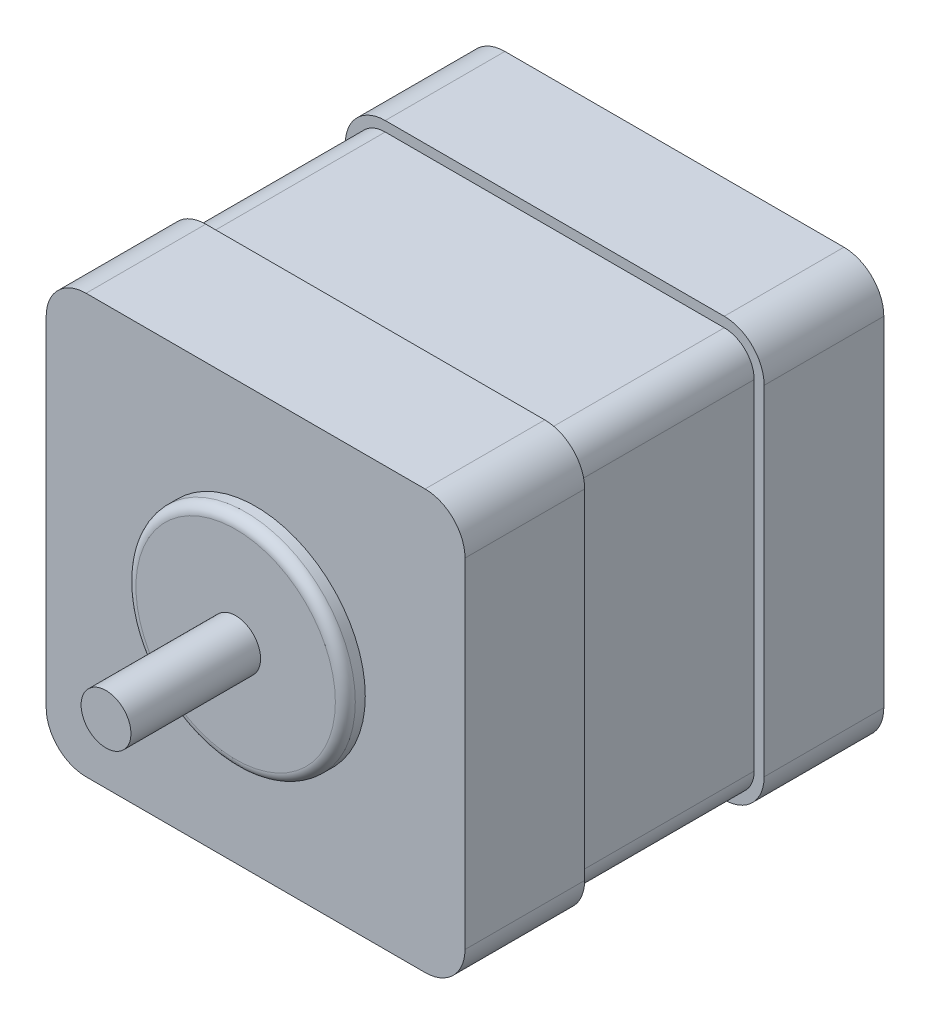
ISO-10303-21;
HEADER;
FILE_DESCRIPTION(('STEP AP214'),'2;1');
FILE_NAME('part.step','',(''),(''),'','','');
FILE_SCHEMA(('AUTOMOTIVE_DESIGN { 1 0 10303 214 1 1 1 1 }'));
ENDSEC;
DATA;
#1=APPLICATION_CONTEXT('core data for automotive mechanical design processes');
#2=APPLICATION_PROTOCOL_DEFINITION('international standard','automotive_design',2000,#1);
#3=PRODUCT_CONTEXT('',#1,'mechanical');
#4=PRODUCT('Part','Part','',(#3));
#5=PRODUCT_RELATED_PRODUCT_CATEGORY('part','',(#4));
#6=PRODUCT_DEFINITION_FORMATION('','',#4);
#7=PRODUCT_DEFINITION_CONTEXT('part definition',#1,'design');
#8=PRODUCT_DEFINITION('design','',#6,#7);
#9=PRODUCT_DEFINITION_SHAPE('','',#8);
#10=(LENGTH_UNIT() NAMED_UNIT(*) SI_UNIT(.MILLI.,.METRE.));
#11=(NAMED_UNIT(*) PLANE_ANGLE_UNIT() SI_UNIT($,.RADIAN.));
#12=(NAMED_UNIT(*) SI_UNIT($,.STERADIAN.) SOLID_ANGLE_UNIT());
#13=UNCERTAINTY_MEASURE_WITH_UNIT(LENGTH_MEASURE(1.E-05),#10,'distance_accuracy_value','');
#14=(GEOMETRIC_REPRESENTATION_CONTEXT(3) GLOBAL_UNCERTAINTY_ASSIGNED_CONTEXT((#13)) GLOBAL_UNIT_ASSIGNED_CONTEXT((#10,
#11,#12)) REPRESENTATION_CONTEXT('',''));
#15=CARTESIAN_POINT('',(0.,0.,0.));
#16=DIRECTION('',(0.,0.,1.));
#17=DIRECTION('',(1.,0.,0.));
#18=AXIS2_PLACEMENT_3D('',#15,#16,#17);
#19=CARTESIAN_POINT('',(-17.,17.,42.));
#20=DIRECTION('',(0.,0.,-1.));
#21=DIRECTION('',(-1.,0.,0.));
#22=AXIS2_PLACEMENT_3D('',#19,#20,#21);
#23=CYLINDRICAL_SURFACE('',#22,3.);
#24=CARTESIAN_POINT('',(-17.,17.,12.));
#25=DIRECTION('',(0.,0.,-1.));
#26=DIRECTION('',(-1.,0.,0.));
#27=AXIS2_PLACEMENT_3D('',#24,#25,#26);
#28=CIRCLE('',#27,3.);
#29=CARTESIAN_POINT('',(-20.,17.,12.));
#30=VERTEX_POINT('',#29);
#31=CARTESIAN_POINT('',(-17.,20.,12.));
#32=VERTEX_POINT('',#31);
#33=EDGE_CURVE('E359',#30,#32,#28,.T.);
#34=ORIENTED_EDGE('',*,*,#33,.F.);
#35=DIRECTION('',(0.,0.,-1.));
#36=VECTOR('',#35,1.);
#37=CARTESIAN_POINT('',(-20.,17.,42.));
#38=LINE('',#37,#36);
#39=CARTESIAN_POINT('',(-20.,17.,30.));
#40=VERTEX_POINT('',#39);
#41=EDGE_CURVE('E489',#40,#30,#38,.T.);
#42=ORIENTED_EDGE('',*,*,#41,.F.);
#43=CARTESIAN_POINT('',(-17.,17.,30.));
#44=DIRECTION('',(0.,0.,1.));
#45=DIRECTION('',(1.,0.,0.));
#46=AXIS2_PLACEMENT_3D('',#43,#44,#45);
#47=CIRCLE('',#46,3.);
#48=CARTESIAN_POINT('',(-17.,20.,30.));
#49=VERTEX_POINT('',#48);
#50=EDGE_CURVE('E451',#49,#40,#47,.T.);
#51=ORIENTED_EDGE('',*,*,#50,.F.);
#52=DIRECTION('',(0.,0.,-1.));
#53=VECTOR('',#52,1.);
#54=CARTESIAN_POINT('',(-17.,20.,42.));
#55=LINE('',#54,#53);
#56=EDGE_CURVE('E521',#49,#32,#55,.T.);
#57=ORIENTED_EDGE('',*,*,#56,.T.);
#58=EDGE_LOOP('',(#34,#42,#51,#57));
#59=FACE_BOUND('',#58,.T.);
#60=ADVANCED_FACE('F79',(#59),#23,.T.);
#61=CARTESIAN_POINT('',(17.,20.,42.));
#62=DIRECTION('',(0.,-1.,0.));
#63=DIRECTION('',(1.,0.,0.));
#64=AXIS2_PLACEMENT_3D('',#61,#62,#63);
#65=PLANE('',#64);
#66=DIRECTION('',(1.,0.,0.));
#67=VECTOR('',#66,1.);
#68=CARTESIAN_POINT('',(17.,20.,12.));
#69=LINE('',#68,#67);
#70=CARTESIAN_POINT('',(17.,20.,12.));
#71=VERTEX_POINT('',#70);
#72=EDGE_CURVE('E356',#32,#71,#69,.T.);
#73=ORIENTED_EDGE('',*,*,#72,.F.);
#74=ORIENTED_EDGE('',*,*,#56,.F.);
#75=DIRECTION('',(-1.,0.,0.));
#76=VECTOR('',#75,1.);
#77=CARTESIAN_POINT('',(17.,20.,30.));
#78=LINE('',#77,#76);
#79=CARTESIAN_POINT('',(17.,20.,30.));
#80=VERTEX_POINT('',#79);
#81=EDGE_CURVE('E455',#80,#49,#78,.T.);
#82=ORIENTED_EDGE('',*,*,#81,.F.);
#83=DIRECTION('',(0.,0.,-1.));
#84=VECTOR('',#83,1.);
#85=CARTESIAN_POINT('',(17.,20.,42.));
#86=LINE('',#85,#84);
#87=EDGE_CURVE('E517',#80,#71,#86,.T.);
#88=ORIENTED_EDGE('',*,*,#87,.T.);
#89=EDGE_LOOP('',(#73,#74,#82,#88));
#90=FACE_BOUND('',#89,.T.);
#91=ADVANCED_FACE('F607',(#90),#65,.F.);
#92=CARTESIAN_POINT('',(17.,17.,42.));
#93=DIRECTION('',(0.,0.,-1.));
#94=DIRECTION('',(-1.,0.,0.));
#95=AXIS2_PLACEMENT_3D('',#92,#93,#94);
#96=CYLINDRICAL_SURFACE('',#95,3.);
#97=CARTESIAN_POINT('',(17.,17.,12.));
#98=DIRECTION('',(0.,0.,-1.));
#99=DIRECTION('',(-1.,0.,0.));
#100=AXIS2_PLACEMENT_3D('',#97,#98,#99);
#101=CIRCLE('',#100,3.);
#102=CARTESIAN_POINT('',(20.,17.,12.));
#103=VERTEX_POINT('',#102);
#104=EDGE_CURVE('E353',#71,#103,#101,.T.);
#105=ORIENTED_EDGE('',*,*,#104,.F.);
#106=ORIENTED_EDGE('',*,*,#87,.F.);
#107=CARTESIAN_POINT('',(17.,17.,30.));
#108=DIRECTION('',(0.,0.,1.));
#109=DIRECTION('',(1.,0.,0.));
#110=AXIS2_PLACEMENT_3D('',#107,#108,#109);
#111=CIRCLE('',#110,3.);
#112=CARTESIAN_POINT('',(20.,17.,30.));
#113=VERTEX_POINT('',#112);
#114=EDGE_CURVE('E459',#113,#80,#111,.T.);
#115=ORIENTED_EDGE('',*,*,#114,.F.);
#116=DIRECTION('',(0.,0.,-1.));
#117=VECTOR('',#116,1.);
#118=CARTESIAN_POINT('',(20.,17.,42.));
#119=LINE('',#118,#117);
#120=EDGE_CURVE('E513',#113,#103,#119,.T.);
#121=ORIENTED_EDGE('',*,*,#120,.T.);
#122=EDGE_LOOP('',(#105,#106,#115,#121));
#123=FACE_BOUND('',#122,.T.);
#124=ADVANCED_FACE('F603',(#123),#96,.T.);
#125=CARTESIAN_POINT('',(20.,-17.,42.));
#126=DIRECTION('',(-1.,0.,0.));
#127=DIRECTION('',(0.,0.,1.));
#128=AXIS2_PLACEMENT_3D('',#125,#126,#127);
#129=PLANE('',#128);
#130=DIRECTION('',(0.,-1.,0.));
#131=VECTOR('',#130,1.);
#132=CARTESIAN_POINT('',(20.,-17.,12.));
#133=LINE('',#132,#131);
#134=CARTESIAN_POINT('',(20.,-17.,12.));
#135=VERTEX_POINT('',#134);
#136=EDGE_CURVE('E350',#103,#135,#133,.T.);
#137=ORIENTED_EDGE('',*,*,#136,.F.);
#138=ORIENTED_EDGE('',*,*,#120,.F.);
#139=DIRECTION('',(0.,1.,0.));
#140=VECTOR('',#139,1.);
#141=CARTESIAN_POINT('',(20.,-17.,30.));
#142=LINE('',#141,#140);
#143=CARTESIAN_POINT('',(20.,-17.,30.));
#144=VERTEX_POINT('',#143);
#145=EDGE_CURVE('E463',#144,#113,#142,.T.);
#146=ORIENTED_EDGE('',*,*,#145,.F.);
#147=DIRECTION('',(0.,0.,-1.));
#148=VECTOR('',#147,1.);
#149=CARTESIAN_POINT('',(20.,-17.,42.));
#150=LINE('',#149,#148);
#151=EDGE_CURVE('E509',#144,#135,#150,.T.);
#152=ORIENTED_EDGE('',*,*,#151,.T.);
#153=EDGE_LOOP('',(#137,#138,#146,#152));
#154=FACE_BOUND('',#153,.T.);
#155=ADVANCED_FACE('F599',(#154),#129,.F.);
#156=CARTESIAN_POINT('',(17.,-17.,42.));
#157=DIRECTION('',(0.,0.,-1.));
#158=DIRECTION('',(-1.,0.,0.));
#159=AXIS2_PLACEMENT_3D('',#156,#157,#158);
#160=CYLINDRICAL_SURFACE('',#159,3.);
#161=CARTESIAN_POINT('',(17.,-17.,12.));
#162=DIRECTION('',(0.,0.,-1.));
#163=DIRECTION('',(-1.,0.,0.));
#164=AXIS2_PLACEMENT_3D('',#161,#162,#163);
#165=CIRCLE('',#164,3.);
#166=CARTESIAN_POINT('',(17.,-20.,12.));
#167=VERTEX_POINT('',#166);
#168=EDGE_CURVE('E347',#135,#167,#165,.T.);
#169=ORIENTED_EDGE('',*,*,#168,.F.);
#170=ORIENTED_EDGE('',*,*,#151,.F.);
#171=CARTESIAN_POINT('',(17.,-17.,30.));
#172=DIRECTION('',(0.,0.,1.));
#173=DIRECTION('',(1.,0.,0.));
#174=AXIS2_PLACEMENT_3D('',#171,#172,#173);
#175=CIRCLE('',#174,3.);
#176=CARTESIAN_POINT('',(17.,-20.,30.));
#177=VERTEX_POINT('',#176);
#178=EDGE_CURVE('E467',#177,#144,#175,.T.);
#179=ORIENTED_EDGE('',*,*,#178,.F.);
#180=DIRECTION('',(0.,0.,-1.));
#181=VECTOR('',#180,1.);
#182=CARTESIAN_POINT('',(17.,-20.,42.));
#183=LINE('',#182,#181);
#184=EDGE_CURVE('E505',#177,#167,#183,.T.);
#185=ORIENTED_EDGE('',*,*,#184,.T.);
#186=EDGE_LOOP('',(#169,#170,#179,#185));
#187=FACE_BOUND('',#186,.T.);
#188=ADVANCED_FACE('F595',(#187),#160,.T.);
#189=CARTESIAN_POINT('',(17.,-20.,42.));
#190=DIRECTION('',(0.,-1.,0.));
#191=DIRECTION('',(1.,0.,0.));
#192=AXIS2_PLACEMENT_3D('',#189,#190,#191);
#193=PLANE('',#192);
#194=DIRECTION('',(0.,0.,-1.));
#195=VECTOR('',#194,1.);
#196=CARTESIAN_POINT('',(-17.,-20.,42.));
#197=LINE('',#196,#195);
#198=CARTESIAN_POINT('',(-17.,-20.,30.));
#199=VERTEX_POINT('',#198);
#200=CARTESIAN_POINT('',(-17.,-20.,12.));
#201=VERTEX_POINT('',#200);
#202=EDGE_CURVE('E501',#199,#201,#197,.T.);
#203=ORIENTED_EDGE('',*,*,#202,.T.);
#204=DIRECTION('',(1.,0.,0.));
#205=VECTOR('',#204,1.);
#206=CARTESIAN_POINT('',(17.,-20.,12.));
#207=LINE('',#206,#205);
#208=EDGE_CURVE('E343',#201,#167,#207,.T.);
#209=ORIENTED_EDGE('',*,*,#208,.T.);
#210=ORIENTED_EDGE('',*,*,#184,.F.);
#211=DIRECTION('',(-1.,0.,0.));
#212=VECTOR('',#211,1.);
#213=CARTESIAN_POINT('',(17.,-20.,30.));
#214=LINE('',#213,#212);
#215=EDGE_CURVE('E471',#177,#199,#214,.T.);
#216=ORIENTED_EDGE('',*,*,#215,.T.);
#217=EDGE_LOOP('',(#203,#209,#210,#216));
#218=FACE_BOUND('',#217,.T.);
#219=ADVANCED_FACE('F592',(#218),#193,.T.);
#220=CARTESIAN_POINT('',(-17.,-17.,42.));
#221=DIRECTION('',(0.,0.,-1.));
#222=DIRECTION('',(-1.,0.,0.));
#223=AXIS2_PLACEMENT_3D('',#220,#221,#222);
#224=CYLINDRICAL_SURFACE('',#223,3.);
#225=DIRECTION('',(0.,0.,-1.));
#226=VECTOR('',#225,1.);
#227=CARTESIAN_POINT('',(-20.,-17.,42.));
#228=LINE('',#227,#226);
#229=CARTESIAN_POINT('',(-20.,-17.,30.));
#230=VERTEX_POINT('',#229);
#231=CARTESIAN_POINT('',(-20.,-17.,12.));
#232=VERTEX_POINT('',#231);
#233=EDGE_CURVE('E498',#230,#232,#228,.T.);
#234=ORIENTED_EDGE('',*,*,#233,.T.);
#235=CARTESIAN_POINT('',(-17.,-17.,12.));
#236=DIRECTION('',(0.,0.,-1.));
#237=DIRECTION('',(-1.,0.,0.));
#238=AXIS2_PLACEMENT_3D('',#235,#236,#237);
#239=CIRCLE('',#238,3.);
#240=EDGE_CURVE('E95',#232,#201,#239,.F.);
#241=ORIENTED_EDGE('',*,*,#240,.T.);
#242=ORIENTED_EDGE('',*,*,#202,.F.);
#243=CARTESIAN_POINT('',(-17.,-17.,30.));
#244=DIRECTION('',(0.,0.,1.));
#245=DIRECTION('',(1.,0.,0.));
#246=AXIS2_PLACEMENT_3D('',#243,#244,#245);
#247=CIRCLE('',#246,3.);
#248=EDGE_CURVE('E102',#199,#230,#247,.F.);
#249=ORIENTED_EDGE('',*,*,#248,.T.);
#250=EDGE_LOOP('',(#234,#241,#242,#249));
#251=FACE_BOUND('',#250,.T.);
#252=ADVANCED_FACE('F589',(#251),#224,.T.);
#253=CARTESIAN_POINT('',(-20.,-17.,42.));
#254=DIRECTION('',(-1.,0.,0.));
#255=DIRECTION('',(0.,0.,1.));
#256=AXIS2_PLACEMENT_3D('',#253,#254,#255);
#257=PLANE('',#256);
#258=ORIENTED_EDGE('',*,*,#41,.T.);
#259=DIRECTION('',(0.,-1.,0.));
#260=VECTOR('',#259,1.);
#261=CARTESIAN_POINT('',(-20.,-17.,12.));
#262=LINE('',#261,#260);
#263=EDGE_CURVE('E13',#30,#232,#262,.T.);
#264=ORIENTED_EDGE('',*,*,#263,.T.);
#265=ORIENTED_EDGE('',*,*,#233,.F.);
#266=DIRECTION('',(0.,1.,0.));
#267=VECTOR('',#266,1.);
#268=CARTESIAN_POINT('',(-20.,-17.,30.));
#269=LINE('',#268,#267);
#270=EDGE_CURVE('E476',#230,#40,#269,.T.);
#271=ORIENTED_EDGE('',*,*,#270,.T.);
#272=EDGE_LOOP('',(#258,#264,#265,#271));
#273=FACE_BOUND('',#272,.T.);
#274=ADVANCED_FACE('F584',(#273),#257,.T.);
#275=CARTESIAN_POINT('',(-17.,17.,42.));
#276=DIRECTION('',(0.,0.,1.));
#277=DIRECTION('',(1.,0.,0.));
#278=AXIS2_PLACEMENT_3D('',#275,#276,#277);
#279=PLANE('',#278);
#280=CARTESIAN_POINT('',(0.,0.,42.));
#281=DIRECTION('',(0.,0.,1.));
#282=DIRECTION('',(1.,0.,0.));
#283=AXIS2_PLACEMENT_3D('',#280,#281,#282);
#284=CIRCLE('',#283,11.);
#285=CARTESIAN_POINT('',(11.,0.,42.));
#286=VERTEX_POINT('',#285);
#287=EDGE_CURVE('E493',#286,#286,#284,.T.);
#288=ORIENTED_EDGE('',*,*,#287,.F.);
#289=EDGE_LOOP('',(#288));
#290=FACE_BOUND('',#289,.T.);
#291=CARTESIAN_POINT('',(-17.,17.,42.));
#292=DIRECTION('',(0.,0.,1.));
#293=DIRECTION('',(1.,0.,0.));
#294=AXIS2_PLACEMENT_3D('',#291,#292,#293);
#295=CIRCLE('',#294,4.);
#296=CARTESIAN_POINT('',(-17.,21.,42.));
#297=VERTEX_POINT('',#296);
#298=CARTESIAN_POINT('',(-21.,17.,42.));
#299=VERTEX_POINT('',#298);
#300=EDGE_CURVE('E362',#297,#299,#295,.T.);
#301=ORIENTED_EDGE('',*,*,#300,.T.);
#302=DIRECTION('',(0.,-1.,0.));
#303=VECTOR('',#302,1.);
#304=CARTESIAN_POINT('',(-21.,17.,42.));
#305=LINE('',#304,#303);
#306=CARTESIAN_POINT('',(-21.,-17.,42.));
#307=VERTEX_POINT('',#306);
#308=EDGE_CURVE('E400',#299,#307,#305,.T.);
#309=ORIENTED_EDGE('',*,*,#308,.T.);
#310=CARTESIAN_POINT('',(-17.,-17.,42.));
#311=DIRECTION('',(0.,0.,1.));
#312=DIRECTION('',(1.,0.,0.));
#313=AXIS2_PLACEMENT_3D('',#310,#311,#312);
#314=CIRCLE('',#313,4.);
#315=CARTESIAN_POINT('',(-17.,-21.,42.));
#316=VERTEX_POINT('',#315);
#317=EDGE_CURVE('E404',#307,#316,#314,.T.);
#318=ORIENTED_EDGE('',*,*,#317,.T.);
#319=DIRECTION('',(1.,0.,0.));
#320=VECTOR('',#319,1.);
#321=CARTESIAN_POINT('',(-17.,-21.,42.));
#322=LINE('',#321,#320);
#323=CARTESIAN_POINT('',(17.,-21.,42.));
#324=VERTEX_POINT('',#323);
#325=EDGE_CURVE('E408',#316,#324,#322,.T.);
#326=ORIENTED_EDGE('',*,*,#325,.T.);
#327=CARTESIAN_POINT('',(17.,-17.,42.));
#328=DIRECTION('',(0.,0.,1.));
#329=DIRECTION('',(1.,0.,0.));
#330=AXIS2_PLACEMENT_3D('',#327,#328,#329);
#331=CIRCLE('',#330,4.);
#332=CARTESIAN_POINT('',(21.,-17.,42.));
#333=VERTEX_POINT('',#332);
#334=EDGE_CURVE('E412',#324,#333,#331,.T.);
#335=ORIENTED_EDGE('',*,*,#334,.T.);
#336=DIRECTION('',(0.,1.,0.));
#337=VECTOR('',#336,1.);
#338=CARTESIAN_POINT('',(21.,-17.,42.));
#339=LINE('',#338,#337);
#340=CARTESIAN_POINT('',(21.,17.,42.));
#341=VERTEX_POINT('',#340);
#342=EDGE_CURVE('E416',#333,#341,#339,.T.);
#343=ORIENTED_EDGE('',*,*,#342,.T.);
#344=CARTESIAN_POINT('',(17.,17.,42.));
#345=DIRECTION('',(0.,0.,1.));
#346=DIRECTION('',(1.,0.,0.));
#347=AXIS2_PLACEMENT_3D('',#344,#345,#346);
#348=CIRCLE('',#347,4.);
#349=CARTESIAN_POINT('',(17.,21.,42.));
#350=VERTEX_POINT('',#349);
#351=EDGE_CURVE('E420',#341,#350,#348,.T.);
#352=ORIENTED_EDGE('',*,*,#351,.T.);
#353=DIRECTION('',(-1.,0.,0.));
#354=VECTOR('',#353,1.);
#355=CARTESIAN_POINT('',(17.,21.,42.));
#356=LINE('',#355,#354);
#357=EDGE_CURVE('E368',#350,#297,#356,.T.);
#358=ORIENTED_EDGE('',*,*,#357,.T.);
#359=EDGE_LOOP('',(#301,#309,#318,#326,#335,#343,#352,#358));
#360=FACE_BOUND('',#359,.T.);
#361=ADVANCED_FACE('F580',(#290,#360),#279,.T.);
#362=CARTESIAN_POINT('',(0.,0.,44.));
#363=DIRECTION('',(0.,0.,-1.));
#364=DIRECTION('',(-1.,0.,0.));
#365=AXIS2_PLACEMENT_3D('',#362,#363,#364);
#366=CYLINDRICAL_SURFACE('',#365,11.);
#367=CARTESIAN_POINT('',(0.,0.,43.));
#368=DIRECTION('',(0.,0.,1.));
#369=DIRECTION('',(1.,0.,0.));
#370=AXIS2_PLACEMENT_3D('',#367,#368,#369);
#371=CIRCLE('',#370,11.);
#372=CARTESIAN_POINT('',(11.,0.,43.));
#373=VERTEX_POINT('',#372);
#374=EDGE_CURVE('E88',#373,#373,#371,.F.);
#375=ORIENTED_EDGE('',*,*,#374,.T.);
#376=EDGE_LOOP('',(#375));
#377=FACE_BOUND('',#376,.T.);
#378=ORIENTED_EDGE('',*,*,#287,.T.);
#379=EDGE_LOOP('',(#378));
#380=FACE_BOUND('',#379,.T.);
#381=ADVANCED_FACE('F576',(#377,#380),#366,.T.);
#382=CARTESIAN_POINT('',(0.,0.,44.));
#383=DIRECTION('',(0.,0.,1.));
#384=DIRECTION('',(1.,0.,0.));
#385=AXIS2_PLACEMENT_3D('',#382,#383,#384);
#386=PLANE('',#385);
#387=CARTESIAN_POINT('',(0.,0.,44.));
#388=DIRECTION('',(0.,0.,1.));
#389=DIRECTION('',(1.,0.,0.));
#390=AXIS2_PLACEMENT_3D('',#387,#388,#389);
#391=CIRCLE('',#390,2.5);
#392=CARTESIAN_POINT('',(-2.5,0.,44.));
#393=VERTEX_POINT('',#392);
#394=EDGE_CURVE('E484',#393,#393,#391,.T.);
#395=ORIENTED_EDGE('',*,*,#394,.F.);
#396=EDGE_LOOP('',(#395));
#397=FACE_BOUND('',#396,.T.);
#398=CARTESIAN_POINT('',(0.,0.,44.));
#399=DIRECTION('',(0.,0.,1.));
#400=DIRECTION('',(1.,0.,0.));
#401=AXIS2_PLACEMENT_3D('',#398,#399,#400);
#402=CIRCLE('',#401,10.);
#403=CARTESIAN_POINT('',(10.,0.,44.));
#404=VERTEX_POINT('',#403);
#405=EDGE_CURVE('E497',#404,#404,#402,.T.);
#406=ORIENTED_EDGE('',*,*,#405,.T.);
#407=EDGE_LOOP('',(#406));
#408=FACE_BOUND('',#407,.T.);
#409=ADVANCED_FACE('F573',(#397,#408),#386,.T.);
#410=CARTESIAN_POINT('',(0.,0.,43.));
#411=DIRECTION('',(0.,0.,1.));
#412=DIRECTION('',(1.,0.,0.));
#413=AXIS2_PLACEMENT_3D('',#410,#411,#412);
#414=TOROIDAL_SURFACE('',#413,10.,1.);
#415=ORIENTED_EDGE('',*,*,#374,.F.);
#416=EDGE_LOOP('',(#415));
#417=FACE_BOUND('',#416,.T.);
#418=ORIENTED_EDGE('',*,*,#405,.F.);
#419=EDGE_LOOP('',(#418));
#420=FACE_BOUND('',#419,.T.);
#421=ADVANCED_FACE('F81',(#417,#420),#414,.T.);
#422=CARTESIAN_POINT('',(0.,0.,57.));
#423=DIRECTION('',(0.,0.,-1.));
#424=DIRECTION('',(-1.,0.,0.));
#425=AXIS2_PLACEMENT_3D('',#422,#423,#424);
#426=CYLINDRICAL_SURFACE('',#425,2.5);
#427=CARTESIAN_POINT('',(0.,0.,57.));
#428=DIRECTION('',(0.,0.,1.));
#429=DIRECTION('',(1.,0.,0.));
#430=AXIS2_PLACEMENT_3D('',#427,#428,#429);
#431=CIRCLE('',#430,2.5);
#432=CARTESIAN_POINT('',(-2.5,0.,57.));
#433=VERTEX_POINT('',#432);
#434=EDGE_CURVE('E485',#433,#433,#431,.T.);
#435=CARTESIAN_POINT('',(-2.5,0.,57.));
#436=CARTESIAN_POINT('',(-2.5,0.,56.8645833333333));
#437=CARTESIAN_POINT('',(-2.5,0.,56.7291666666667));
#438=CARTESIAN_POINT('',(-2.5,0.,56.4583333333333));
#439=CARTESIAN_POINT('',(-2.5,0.,56.3229166666667));
#440=CARTESIAN_POINT('',(-2.5,0.,56.0520833333333));
#441=CARTESIAN_POINT('',(-2.5,0.,55.9166666666667));
#442=CARTESIAN_POINT('',(-2.5,0.,55.6458333333333));
#443=CARTESIAN_POINT('',(-2.5,0.,55.5104166666667));
#444=CARTESIAN_POINT('',(-2.5,0.,55.2395833333333));
#445=CARTESIAN_POINT('',(-2.5,0.,55.1041666666667));
#446=CARTESIAN_POINT('',(-2.5,0.,54.8333333333333));
#447=CARTESIAN_POINT('',(-2.5,0.,54.6979166666667));
#448=CARTESIAN_POINT('',(-2.5,0.,54.4270833333333));
#449=CARTESIAN_POINT('',(-2.5,0.,54.2916666666667));
#450=CARTESIAN_POINT('',(-2.5,0.,54.0208333333333));
#451=CARTESIAN_POINT('',(-2.5,0.,53.8854166666667));
#452=CARTESIAN_POINT('',(-2.5,0.,53.6145833333333));
#453=CARTESIAN_POINT('',(-2.5,0.,53.4791666666667));
#454=CARTESIAN_POINT('',(-2.5,0.,53.2083333333333));
#455=CARTESIAN_POINT('',(-2.5,0.,53.0729166666667));
#456=CARTESIAN_POINT('',(-2.5,0.,52.8020833333333));
#457=CARTESIAN_POINT('',(-2.5,0.,52.6666666666667));
#458=CARTESIAN_POINT('',(-2.5,0.,52.3958333333333));
#459=CARTESIAN_POINT('',(-2.5,0.,52.2604166666667));
#460=CARTESIAN_POINT('',(-2.5,0.,51.9895833333333));
#461=CARTESIAN_POINT('',(-2.5,0.,51.8541666666667));
#462=CARTESIAN_POINT('',(-2.5,0.,51.5833333333333));
#463=CARTESIAN_POINT('',(-2.5,0.,51.4479166666667));
#464=CARTESIAN_POINT('',(-2.5,0.,51.1770833333333));
#465=CARTESIAN_POINT('',(-2.5,0.,51.0416666666667));
#466=CARTESIAN_POINT('',(-2.5,0.,50.7708333333333));
#467=CARTESIAN_POINT('',(-2.5,0.,50.6354166666667));
#468=CARTESIAN_POINT('',(-2.5,0.,50.3645833333333));
#469=CARTESIAN_POINT('',(-2.5,0.,50.2291666666667));
#470=CARTESIAN_POINT('',(-2.5,0.,49.9583333333333));
#471=CARTESIAN_POINT('',(-2.5,0.,49.8229166666667));
#472=CARTESIAN_POINT('',(-2.5,0.,49.5520833333333));
#473=CARTESIAN_POINT('',(-2.5,0.,49.4166666666667));
#474=CARTESIAN_POINT('',(-2.5,0.,49.1458333333333));
#475=CARTESIAN_POINT('',(-2.5,0.,49.0104166666667));
#476=CARTESIAN_POINT('',(-2.5,0.,48.7395833333333));
#477=CARTESIAN_POINT('',(-2.5,0.,48.6041666666667));
#478=CARTESIAN_POINT('',(-2.5,0.,48.3333333333333));
#479=CARTESIAN_POINT('',(-2.5,0.,48.1979166666667));
#480=CARTESIAN_POINT('',(-2.5,0.,47.9270833333333));
#481=CARTESIAN_POINT('',(-2.5,0.,47.7916666666667));
#482=CARTESIAN_POINT('',(-2.5,0.,47.5208333333333));
#483=CARTESIAN_POINT('',(-2.5,0.,47.3854166666667));
#484=CARTESIAN_POINT('',(-2.5,0.,47.1145833333333));
#485=CARTESIAN_POINT('',(-2.5,0.,46.9791666666667));
#486=CARTESIAN_POINT('',(-2.5,0.,46.7083333333333));
#487=CARTESIAN_POINT('',(-2.5,0.,46.5729166666667));
#488=CARTESIAN_POINT('',(-2.5,0.,46.3020833333333));
#489=CARTESIAN_POINT('',(-2.5,0.,46.1666666666667));
#490=CARTESIAN_POINT('',(-2.5,0.,45.8958333333333));
#491=CARTESIAN_POINT('',(-2.5,0.,45.7604166666667));
#492=CARTESIAN_POINT('',(-2.5,0.,45.4895833333333));
#493=CARTESIAN_POINT('',(-2.5,0.,45.3541666666667));
#494=CARTESIAN_POINT('',(-2.5,0.,45.0833333333333));
#495=CARTESIAN_POINT('',(-2.5,0.,44.9479166666667));
#496=CARTESIAN_POINT('',(-2.5,0.,44.6770833333333));
#497=CARTESIAN_POINT('',(-2.5,0.,44.5416666666667));
#498=CARTESIAN_POINT('',(-2.5,0.,44.2708333333333));
#499=CARTESIAN_POINT('',(-2.5,0.,44.1354166666667));
#500=CARTESIAN_POINT('',(-2.5,0.,44.));
#501=B_SPLINE_CURVE_WITH_KNOTS('',3,(#435,#436,#437,#438,#439,#440,#441,#442,#443,#444,#445,
#446,#447,#448,#449,#450,#451,#452,#453,#454,#455,#456,#457,#458,#459,#460,#461,#462,#463,#464,
#465,#466,#467,#468,#469,#470,#471,#472,#473,#474,#475,#476,#477,#478,#479,#480,#481,#482,#483,
#484,#485,#486,#487,#488,#489,#490,#491,#492,#493,#494,#495,#496,#497,#498,#499,#500),
.UNSPECIFIED.,.F.,.F.,(4,2,2,2,2,2,2,2,2,2,2,2,2,2,2,2,2,2,2,2,2,2,2,2,2,2,2,2,2,2,2,2,4),(0.,
0.406249999999997,0.812499999999994,1.21875,1.62499999999999,2.03125,2.4375,2.84374999999999,
3.25,3.65624999999999,4.0625,4.46874999999999,4.875,5.28124999999999,5.6875,6.09374999999999,
6.49999999999999,6.90625,7.31249999999999,7.71875,8.12499999999999,8.53124999999999,
8.93749999999999,9.34374999999999,9.74999999999999,10.15625,10.5625,10.96875,11.375,11.78125,
12.1875,12.59375,13.),.UNSPECIFIED.);
#502=EDGE_CURVE('BSEAM568',#433,#393,#501,.T.);
#503=ORIENTED_EDGE('',*,*,#434,.F.);
#504=ORIENTED_EDGE('',*,*,#394,.T.);
#505=ORIENTED_EDGE('',*,*,#502,.T.);
#506=ORIENTED_EDGE('',*,*,#502,.F.);
#507=EDGE_LOOP('',(#503,#505,#504,#506));
#508=FACE_BOUND('',#507,.T.);
#509=ADVANCED_FACE('F568',(#508),#426,.T.);
#510=CARTESIAN_POINT('',(0.,0.,57.));
#511=DIRECTION('',(0.,0.,1.));
#512=DIRECTION('',(1.,0.,0.));
#513=AXIS2_PLACEMENT_3D('',#510,#511,#512);
#514=PLANE('',#513);
#515=ORIENTED_EDGE('',*,*,#434,.T.);
#516=EDGE_LOOP('',(#515));
#517=FACE_BOUND('',#516,.T.);
#518=ADVANCED_FACE('F554',(#517),#514,.T.);
#519=CARTESIAN_POINT('',(-17.,17.,30.));
#520=DIRECTION('',(0.,0.,1.));
#521=DIRECTION('',(1.,0.,0.));
#522=AXIS2_PLACEMENT_3D('',#519,#520,#521);
#523=PLANE('',#522);
#524=CARTESIAN_POINT('',(-17.,17.,30.));
#525=DIRECTION('',(0.,0.,1.));
#526=DIRECTION('',(1.,0.,0.));
#527=AXIS2_PLACEMENT_3D('',#524,#525,#526);
#528=CIRCLE('',#527,4.);
#529=CARTESIAN_POINT('',(-17.,21.,30.));
#530=VERTEX_POINT('',#529);
#531=CARTESIAN_POINT('',(-21.,17.,30.));
#532=VERTEX_POINT('',#531);
#533=EDGE_CURVE('E363',#530,#532,#528,.T.);
#534=ORIENTED_EDGE('',*,*,#533,.F.);
#535=DIRECTION('',(-1.,0.,0.));
#536=VECTOR('',#535,1.);
#537=CARTESIAN_POINT('',(17.,21.,30.));
#538=LINE('',#537,#536);
#539=CARTESIAN_POINT('',(17.,21.,30.));
#540=VERTEX_POINT('',#539);
#541=EDGE_CURVE('E392',#540,#530,#538,.T.);
#542=ORIENTED_EDGE('',*,*,#541,.F.);
#543=CARTESIAN_POINT('',(17.,17.,30.));
#544=DIRECTION('',(0.,0.,1.));
#545=DIRECTION('',(1.,0.,0.));
#546=AXIS2_PLACEMENT_3D('',#543,#544,#545);
#547=CIRCLE('',#546,4.);
#548=CARTESIAN_POINT('',(21.,17.,30.));
#549=VERTEX_POINT('',#548);
#550=EDGE_CURVE('E388',#549,#540,#547,.T.);
#551=ORIENTED_EDGE('',*,*,#550,.F.);
#552=DIRECTION('',(0.,1.,0.));
#553=VECTOR('',#552,1.);
#554=CARTESIAN_POINT('',(21.,-17.,30.));
#555=LINE('',#554,#553);
#556=CARTESIAN_POINT('',(21.,-17.,30.));
#557=VERTEX_POINT('',#556);
#558=EDGE_CURVE('E384',#557,#549,#555,.T.);
#559=ORIENTED_EDGE('',*,*,#558,.F.);
#560=CARTESIAN_POINT('',(17.,-17.,30.));
#561=DIRECTION('',(0.,0.,1.));
#562=DIRECTION('',(1.,0.,0.));
#563=AXIS2_PLACEMENT_3D('',#560,#561,#562);
#564=CIRCLE('',#563,4.);
#565=CARTESIAN_POINT('',(17.,-21.,30.));
#566=VERTEX_POINT('',#565);
#567=EDGE_CURVE('E380',#566,#557,#564,.T.);
#568=ORIENTED_EDGE('',*,*,#567,.F.);
#569=DIRECTION('',(1.,0.,0.));
#570=VECTOR('',#569,1.);
#571=CARTESIAN_POINT('',(-17.,-21.,30.));
#572=LINE('',#571,#570);
#573=CARTESIAN_POINT('',(-17.,-21.,30.));
#574=VERTEX_POINT('',#573);
#575=EDGE_CURVE('E376',#574,#566,#572,.T.);
#576=ORIENTED_EDGE('',*,*,#575,.F.);
#577=CARTESIAN_POINT('',(-17.,-17.,30.));
#578=DIRECTION('',(0.,0.,1.));
#579=DIRECTION('',(1.,0.,0.));
#580=AXIS2_PLACEMENT_3D('',#577,#578,#579);
#581=CIRCLE('',#580,4.);
#582=CARTESIAN_POINT('',(-21.,-17.,30.));
#583=VERTEX_POINT('',#582);
#584=EDGE_CURVE('E372',#583,#574,#581,.T.);
#585=ORIENTED_EDGE('',*,*,#584,.F.);
#586=DIRECTION('',(0.,-1.,0.));
#587=VECTOR('',#586,1.);
#588=CARTESIAN_POINT('',(-21.,17.,30.));
#589=LINE('',#588,#587);
#590=EDGE_CURVE('E367',#532,#583,#589,.T.);
#591=ORIENTED_EDGE('',*,*,#590,.F.);
#592=EDGE_LOOP('',(#534,#542,#551,#559,#568,#576,#585,#591));
#593=FACE_BOUND('',#592,.T.);
#594=ORIENTED_EDGE('',*,*,#270,.F.);
#595=ORIENTED_EDGE('',*,*,#248,.F.);
#596=ORIENTED_EDGE('',*,*,#215,.F.);
#597=ORIENTED_EDGE('',*,*,#178,.T.);
#598=ORIENTED_EDGE('',*,*,#145,.T.);
#599=ORIENTED_EDGE('',*,*,#114,.T.);
#600=ORIENTED_EDGE('',*,*,#81,.T.);
#601=ORIENTED_EDGE('',*,*,#50,.T.);
#602=EDGE_LOOP('',(#594,#595,#596,#597,#598,#599,#600,#601));
#603=FACE_BOUND('',#602,.T.);
#604=ADVANCED_FACE('F543',(#593,#603),#523,.F.);
#605=CARTESIAN_POINT('',(-17.,17.,30.));
#606=DIRECTION('',(0.,0.,1.));
#607=DIRECTION('',(1.,0.,0.));
#608=AXIS2_PLACEMENT_3D('',#605,#606,#607);
#609=CYLINDRICAL_SURFACE('',#608,4.);
#610=ORIENTED_EDGE('',*,*,#300,.F.);
#611=DIRECTION('',(0.,0.,1.));
#612=VECTOR('',#611,1.);
#613=CARTESIAN_POINT('',(-17.,21.,30.));
#614=LINE('',#613,#612);
#615=EDGE_CURVE('E427',#530,#297,#614,.T.);
#616=ORIENTED_EDGE('',*,*,#615,.F.);
#617=ORIENTED_EDGE('',*,*,#533,.T.);
#618=DIRECTION('',(0.,0.,1.));
#619=VECTOR('',#618,1.);
#620=CARTESIAN_POINT('',(-21.,17.,30.));
#621=LINE('',#620,#619);
#622=EDGE_CURVE('E396',#532,#299,#621,.T.);
#623=ORIENTED_EDGE('',*,*,#622,.T.);
#624=EDGE_LOOP('',(#610,#616,#617,#623));
#625=FACE_BOUND('',#624,.T.);
#626=ADVANCED_FACE('F553',(#625),#609,.T.);
#627=CARTESIAN_POINT('',(17.,21.,30.));
#628=DIRECTION('',(0.,1.,0.));
#629=DIRECTION('',(0.,0.,1.));
#630=AXIS2_PLACEMENT_3D('',#627,#628,#629);
#631=PLANE('',#630);
#632=ORIENTED_EDGE('',*,*,#357,.F.);
#633=DIRECTION('',(0.,0.,1.));
#634=VECTOR('',#633,1.);
#635=CARTESIAN_POINT('',(17.,21.,30.));
#636=LINE('',#635,#634);
#637=EDGE_CURVE('E431',#540,#350,#636,.T.);
#638=ORIENTED_EDGE('',*,*,#637,.F.);
#639=ORIENTED_EDGE('',*,*,#541,.T.);
#640=ORIENTED_EDGE('',*,*,#615,.T.);
#641=EDGE_LOOP('',(#632,#638,#639,#640));
#642=FACE_BOUND('',#641,.T.);
#643=ADVANCED_FACE('F681',(#642),#631,.T.);
#644=CARTESIAN_POINT('',(17.,17.,30.));
#645=DIRECTION('',(0.,0.,1.));
#646=DIRECTION('',(1.,0.,0.));
#647=AXIS2_PLACEMENT_3D('',#644,#645,#646);
#648=CYLINDRICAL_SURFACE('',#647,4.);
#649=ORIENTED_EDGE('',*,*,#351,.F.);
#650=DIRECTION('',(0.,0.,1.));
#651=VECTOR('',#650,1.);
#652=CARTESIAN_POINT('',(21.,17.,30.));
#653=LINE('',#652,#651);
#654=EDGE_CURVE('E434',#549,#341,#653,.T.);
#655=ORIENTED_EDGE('',*,*,#654,.F.);
#656=ORIENTED_EDGE('',*,*,#550,.T.);
#657=ORIENTED_EDGE('',*,*,#637,.T.);
#658=EDGE_LOOP('',(#649,#655,#656,#657));
#659=FACE_BOUND('',#658,.T.);
#660=ADVANCED_FACE('F830',(#659),#648,.T.);
#661=CARTESIAN_POINT('',(21.,-17.,30.));
#662=DIRECTION('',(1.,0.,0.));
#663=DIRECTION('',(0.,0.,-1.));
#664=AXIS2_PLACEMENT_3D('',#661,#662,#663);
#665=PLANE('',#664);
#666=ORIENTED_EDGE('',*,*,#342,.F.);
#667=DIRECTION('',(0.,0.,1.));
#668=VECTOR('',#667,1.);
#669=CARTESIAN_POINT('',(21.,-17.,30.));
#670=LINE('',#669,#668);
#671=EDGE_CURVE('E437',#557,#333,#670,.T.);
#672=ORIENTED_EDGE('',*,*,#671,.F.);
#673=ORIENTED_EDGE('',*,*,#558,.T.);
#674=ORIENTED_EDGE('',*,*,#654,.T.);
#675=EDGE_LOOP('',(#666,#672,#673,#674));
#676=FACE_BOUND('',#675,.T.);
#677=ADVANCED_FACE('F819',(#676),#665,.T.);
#678=CARTESIAN_POINT('',(17.,-17.,30.));
#679=DIRECTION('',(0.,0.,1.));
#680=DIRECTION('',(1.,0.,0.));
#681=AXIS2_PLACEMENT_3D('',#678,#679,#680);
#682=CYLINDRICAL_SURFACE('',#681,4.);
#683=ORIENTED_EDGE('',*,*,#334,.F.);
#684=DIRECTION('',(0.,0.,1.));
#685=VECTOR('',#684,1.);
#686=CARTESIAN_POINT('',(17.,-21.,30.));
#687=LINE('',#686,#685);
#688=EDGE_CURVE('E440',#566,#324,#687,.T.);
#689=ORIENTED_EDGE('',*,*,#688,.F.);
#690=ORIENTED_EDGE('',*,*,#567,.T.);
#691=ORIENTED_EDGE('',*,*,#671,.T.);
#692=EDGE_LOOP('',(#683,#689,#690,#691));
#693=FACE_BOUND('',#692,.T.);
#694=ADVANCED_FACE('F808',(#693),#682,.T.);
#695=CARTESIAN_POINT('',(-17.,-21.,30.));
#696=DIRECTION('',(0.,-1.,0.));
#697=DIRECTION('',(1.,0.,0.));
#698=AXIS2_PLACEMENT_3D('',#695,#696,#697);
#699=PLANE('',#698);
#700=ORIENTED_EDGE('',*,*,#325,.F.);
#701=DIRECTION('',(0.,0.,1.));
#702=VECTOR('',#701,1.);
#703=CARTESIAN_POINT('',(-17.,-21.,30.));
#704=LINE('',#703,#702);
#705=EDGE_CURVE('E443',#574,#316,#704,.T.);
#706=ORIENTED_EDGE('',*,*,#705,.F.);
#707=ORIENTED_EDGE('',*,*,#575,.T.);
#708=ORIENTED_EDGE('',*,*,#688,.T.);
#709=EDGE_LOOP('',(#700,#706,#707,#708));
#710=FACE_BOUND('',#709,.T.);
#711=ADVANCED_FACE('F797',(#710),#699,.T.);
#712=CARTESIAN_POINT('',(-17.,-17.,30.));
#713=DIRECTION('',(0.,0.,1.));
#714=DIRECTION('',(1.,0.,0.));
#715=AXIS2_PLACEMENT_3D('',#712,#713,#714);
#716=CYLINDRICAL_SURFACE('',#715,4.);
#717=ORIENTED_EDGE('',*,*,#317,.F.);
#718=DIRECTION('',(0.,0.,1.));
#719=VECTOR('',#718,1.);
#720=CARTESIAN_POINT('',(-21.,-17.,30.));
#721=LINE('',#720,#719);
#722=EDGE_CURVE('E446',#583,#307,#721,.T.);
#723=ORIENTED_EDGE('',*,*,#722,.F.);
#724=ORIENTED_EDGE('',*,*,#584,.T.);
#725=ORIENTED_EDGE('',*,*,#705,.T.);
#726=EDGE_LOOP('',(#717,#723,#724,#725));
#727=FACE_BOUND('',#726,.T.);
#728=ADVANCED_FACE('F639',(#727),#716,.T.);
#729=CARTESIAN_POINT('',(-21.,17.,30.));
#730=DIRECTION('',(-1.,0.,0.));
#731=DIRECTION('',(0.,0.,1.));
#732=AXIS2_PLACEMENT_3D('',#729,#730,#731);
#733=PLANE('',#732);
#734=ORIENTED_EDGE('',*,*,#308,.F.);
#735=ORIENTED_EDGE('',*,*,#622,.F.);
#736=ORIENTED_EDGE('',*,*,#590,.T.);
#737=ORIENTED_EDGE('',*,*,#722,.T.);
#738=EDGE_LOOP('',(#734,#735,#736,#737));
#739=FACE_BOUND('',#738,.T.);
#740=ADVANCED_FACE('F632',(#739),#733,.T.);
#741=CARTESIAN_POINT('',(-17.,-17.,12.));
#742=DIRECTION('',(0.,0.,-1.));
#743=DIRECTION('',(-1.,0.,0.));
#744=AXIS2_PLACEMENT_3D('',#741,#742,#743);
#745=PLANE('',#744);
#746=CARTESIAN_POINT('',(-17.,-17.,12.));
#747=DIRECTION('',(0.,0.,-1.));
#748=DIRECTION('',(-1.,0.,0.));
#749=AXIS2_PLACEMENT_3D('',#746,#747,#748);
#750=CIRCLE('',#749,4.);
#751=CARTESIAN_POINT('',(-17.,-21.,12.));
#752=VERTEX_POINT('',#751);
#753=CARTESIAN_POINT('',(-21.,-17.,12.));
#754=VERTEX_POINT('',#753);
#755=EDGE_CURVE('E261',#752,#754,#750,.T.);
#756=ORIENTED_EDGE('',*,*,#755,.F.);
#757=DIRECTION('',(-1.,0.,0.));
#758=VECTOR('',#757,1.);
#759=CARTESIAN_POINT('',(17.,-21.,12.));
#760=LINE('',#759,#758);
#761=CARTESIAN_POINT('',(17.,-21.,12.));
#762=VERTEX_POINT('',#761);
#763=EDGE_CURVE('E254',#762,#752,#760,.T.);
#764=ORIENTED_EDGE('',*,*,#763,.F.);
#765=CARTESIAN_POINT('',(17.,-17.,12.));
#766=DIRECTION('',(0.,0.,-1.));
#767=DIRECTION('',(-1.,0.,0.));
#768=AXIS2_PLACEMENT_3D('',#765,#766,#767);
#769=CIRCLE('',#768,4.);
#770=CARTESIAN_POINT('',(21.,-17.,12.));
#771=VERTEX_POINT('',#770);
#772=EDGE_CURVE('E292',#771,#762,#769,.T.);
#773=ORIENTED_EDGE('',*,*,#772,.F.);
#774=DIRECTION('',(0.,-1.,0.));
#775=VECTOR('',#774,1.);
#776=CARTESIAN_POINT('',(21.,17.,12.));
#777=LINE('',#776,#775);
#778=CARTESIAN_POINT('',(21.,17.,12.));
#779=VERTEX_POINT('',#778);
#780=EDGE_CURVE('E288',#779,#771,#777,.T.);
#781=ORIENTED_EDGE('',*,*,#780,.F.);
#782=CARTESIAN_POINT('',(17.,17.,12.));
#783=DIRECTION('',(0.,0.,-1.));
#784=DIRECTION('',(-1.,0.,0.));
#785=AXIS2_PLACEMENT_3D('',#782,#783,#784);
#786=CIRCLE('',#785,4.);
#787=CARTESIAN_POINT('',(17.,21.,12.));
#788=VERTEX_POINT('',#787);
#789=EDGE_CURVE('E284',#788,#779,#786,.T.);
#790=ORIENTED_EDGE('',*,*,#789,.F.);
#791=DIRECTION('',(1.,0.,0.));
#792=VECTOR('',#791,1.);
#793=CARTESIAN_POINT('',(-17.,21.,12.));
#794=LINE('',#793,#792);
#795=CARTESIAN_POINT('',(-17.,21.,12.));
#796=VERTEX_POINT('',#795);
#797=EDGE_CURVE('E280',#796,#788,#794,.T.);
#798=ORIENTED_EDGE('',*,*,#797,.F.);
#799=CARTESIAN_POINT('',(-17.,17.,12.));
#800=DIRECTION('',(0.,0.,-1.));
#801=DIRECTION('',(-1.,0.,0.));
#802=AXIS2_PLACEMENT_3D('',#799,#800,#801);
#803=CIRCLE('',#802,4.);
#804=CARTESIAN_POINT('',(-21.,17.,12.));
#805=VERTEX_POINT('',#804);
#806=EDGE_CURVE('E265',#805,#796,#803,.T.);
#807=ORIENTED_EDGE('',*,*,#806,.F.);
#808=DIRECTION('',(0.,1.,0.));
#809=VECTOR('',#808,1.);
#810=CARTESIAN_POINT('',(-21.,-17.,12.));
#811=LINE('',#810,#809);
#812=EDGE_CURVE('E245',#754,#805,#811,.T.);
#813=ORIENTED_EDGE('',*,*,#812,.F.);
#814=EDGE_LOOP('',(#756,#764,#773,#781,#790,#798,#807,#813));
#815=FACE_BOUND('',#814,.T.);
#816=ORIENTED_EDGE('',*,*,#263,.F.);
#817=ORIENTED_EDGE('',*,*,#33,.T.);
#818=ORIENTED_EDGE('',*,*,#72,.T.);
#819=ORIENTED_EDGE('',*,*,#104,.T.);
#820=ORIENTED_EDGE('',*,*,#136,.T.);
#821=ORIENTED_EDGE('',*,*,#168,.T.);
#822=ORIENTED_EDGE('',*,*,#208,.F.);
#823=ORIENTED_EDGE('',*,*,#240,.F.);
#824=EDGE_LOOP('',(#816,#817,#818,#819,#820,#821,#822,#823));
#825=FACE_BOUND('',#824,.T.);
#826=ADVANCED_FACE('F259',(#815,#825),#745,.F.);
#827=CARTESIAN_POINT('',(-17.,-17.,12.));
#828=DIRECTION('',(0.,0.,-1.));
#829=DIRECTION('',(-1.,0.,0.));
#830=AXIS2_PLACEMENT_3D('',#827,#828,#829);
#831=CYLINDRICAL_SURFACE('',#830,4.);
#832=CARTESIAN_POINT('',(-17.,-17.,0.));
#833=DIRECTION('',(0.,0.,-1.));
#834=DIRECTION('',(-1.,0.,0.));
#835=AXIS2_PLACEMENT_3D('',#832,#833,#834);
#836=CIRCLE('',#835,4.);
#837=CARTESIAN_POINT('',(-17.,-21.,0.));
#838=VERTEX_POINT('',#837);
#839=CARTESIAN_POINT('',(-21.,-17.,0.));
#840=VERTEX_POINT('',#839);
#841=EDGE_CURVE('E298',#838,#840,#836,.T.);
#842=ORIENTED_EDGE('',*,*,#841,.F.);
#843=DIRECTION('',(0.,0.,-1.));
#844=VECTOR('',#843,1.);
#845=CARTESIAN_POINT('',(-17.,-21.,12.));
#846=LINE('',#845,#844);
#847=EDGE_CURVE('E269',#752,#838,#846,.T.);
#848=ORIENTED_EDGE('',*,*,#847,.F.);
#849=ORIENTED_EDGE('',*,*,#755,.T.);
#850=DIRECTION('',(0.,0.,-1.));
#851=VECTOR('',#850,1.);
#852=CARTESIAN_POINT('',(-21.,-17.,12.));
#853=LINE('',#852,#851);
#854=EDGE_CURVE('E242',#754,#840,#853,.T.);
#855=ORIENTED_EDGE('',*,*,#854,.T.);
#856=EDGE_LOOP('',(#842,#848,#849,#855));
#857=FACE_BOUND('',#856,.T.);
#858=ADVANCED_FACE('F268',(#857),#831,.T.);
#859=CARTESIAN_POINT('',(17.,-21.,12.));
#860=DIRECTION('',(0.,-1.,0.));
#861=DIRECTION('',(0.,0.,-1.));
#862=AXIS2_PLACEMENT_3D('',#859,#860,#861);
#863=PLANE('',#862);
#864=DIRECTION('',(-1.,0.,0.));
#865=VECTOR('',#864,1.);
#866=CARTESIAN_POINT('',(17.,-21.,0.));
#867=LINE('',#866,#865);
#868=CARTESIAN_POINT('',(17.,-21.,0.));
#869=VERTEX_POINT('',#868);
#870=EDGE_CURVE('E271',#869,#838,#867,.T.);
#871=ORIENTED_EDGE('',*,*,#870,.F.);
#872=DIRECTION('',(0.,0.,-1.));
#873=VECTOR('',#872,1.);
#874=CARTESIAN_POINT('',(17.,-21.,12.));
#875=LINE('',#874,#873);
#876=EDGE_CURVE('E324',#762,#869,#875,.T.);
#877=ORIENTED_EDGE('',*,*,#876,.F.);
#878=ORIENTED_EDGE('',*,*,#763,.T.);
#879=ORIENTED_EDGE('',*,*,#847,.T.);
#880=EDGE_LOOP('',(#871,#877,#878,#879));
#881=FACE_BOUND('',#880,.T.);
#882=ADVANCED_FACE('F638',(#881),#863,.T.);
#883=CARTESIAN_POINT('',(17.,-17.,12.));
#884=DIRECTION('',(0.,0.,-1.));
#885=DIRECTION('',(-1.,0.,0.));
#886=AXIS2_PLACEMENT_3D('',#883,#884,#885);
#887=CYLINDRICAL_SURFACE('',#886,4.);
#888=CARTESIAN_POINT('',(17.,-17.,0.));
#889=DIRECTION('',(0.,0.,-1.));
#890=DIRECTION('',(-1.,0.,0.));
#891=AXIS2_PLACEMENT_3D('',#888,#889,#890);
#892=CIRCLE('',#891,4.);
#893=CARTESIAN_POINT('',(21.,-17.,0.));
#894=VERTEX_POINT('',#893);
#895=EDGE_CURVE('E275',#894,#869,#892,.T.);
#896=ORIENTED_EDGE('',*,*,#895,.F.);
#897=DIRECTION('',(0.,0.,-1.));
#898=VECTOR('',#897,1.);
#899=CARTESIAN_POINT('',(21.,-17.,12.));
#900=LINE('',#899,#898);
#901=EDGE_CURVE('E327',#771,#894,#900,.T.);
#902=ORIENTED_EDGE('',*,*,#901,.F.);
#903=ORIENTED_EDGE('',*,*,#772,.T.);
#904=ORIENTED_EDGE('',*,*,#876,.T.);
#905=EDGE_LOOP('',(#896,#902,#903,#904));
#906=FACE_BOUND('',#905,.T.);
#907=ADVANCED_FACE('F644',(#906),#887,.T.);
#908=CARTESIAN_POINT('',(21.,17.,12.));
#909=DIRECTION('',(1.,0.,0.));
#910=DIRECTION('',(0.,1.,0.));
#911=AXIS2_PLACEMENT_3D('',#908,#909,#910);
#912=PLANE('',#911);
#913=DIRECTION('',(0.,-1.,0.));
#914=VECTOR('',#913,1.);
#915=CARTESIAN_POINT('',(21.,17.,0.));
#916=LINE('',#915,#914);
#917=CARTESIAN_POINT('',(21.,17.,0.));
#918=VERTEX_POINT('',#917);
#919=EDGE_CURVE('E315',#918,#894,#916,.T.);
#920=ORIENTED_EDGE('',*,*,#919,.F.);
#921=DIRECTION('',(0.,0.,-1.));
#922=VECTOR('',#921,1.);
#923=CARTESIAN_POINT('',(21.,17.,12.));
#924=LINE('',#923,#922);
#925=EDGE_CURVE('E330',#779,#918,#924,.T.);
#926=ORIENTED_EDGE('',*,*,#925,.F.);
#927=ORIENTED_EDGE('',*,*,#780,.T.);
#928=ORIENTED_EDGE('',*,*,#901,.T.);
#929=EDGE_LOOP('',(#920,#926,#927,#928));
#930=FACE_BOUND('',#929,.T.);
#931=ADVANCED_FACE('F648',(#930),#912,.T.);
#932=CARTESIAN_POINT('',(17.,17.,12.));
#933=DIRECTION('',(0.,0.,-1.));
#934=DIRECTION('',(-1.,0.,0.));
#935=AXIS2_PLACEMENT_3D('',#932,#933,#934);
#936=CYLINDRICAL_SURFACE('',#935,4.);
#937=CARTESIAN_POINT('',(17.,17.,0.));
#938=DIRECTION('',(0.,0.,-1.));
#939=DIRECTION('',(-1.,0.,0.));
#940=AXIS2_PLACEMENT_3D('',#937,#938,#939);
#941=CIRCLE('',#940,4.);
#942=CARTESIAN_POINT('',(17.,21.,0.));
#943=VERTEX_POINT('',#942);
#944=EDGE_CURVE('E311',#943,#918,#941,.T.);
#945=ORIENTED_EDGE('',*,*,#944,.F.);
#946=DIRECTION('',(0.,0.,-1.));
#947=VECTOR('',#946,1.);
#948=CARTESIAN_POINT('',(17.,21.,12.));
#949=LINE('',#948,#947);
#950=EDGE_CURVE('E333',#788,#943,#949,.T.);
#951=ORIENTED_EDGE('',*,*,#950,.F.);
#952=ORIENTED_EDGE('',*,*,#789,.T.);
#953=ORIENTED_EDGE('',*,*,#925,.T.);
#954=EDGE_LOOP('',(#945,#951,#952,#953));
#955=FACE_BOUND('',#954,.T.);
#956=ADVANCED_FACE('F652',(#955),#936,.T.);
#957=CARTESIAN_POINT('',(-17.,21.,12.));
#958=DIRECTION('',(0.,1.,0.));
#959=DIRECTION('',(0.,0.,1.));
#960=AXIS2_PLACEMENT_3D('',#957,#958,#959);
#961=PLANE('',#960);
#962=DIRECTION('',(1.,0.,0.));
#963=VECTOR('',#962,1.);
#964=CARTESIAN_POINT('',(-17.,21.,0.));
#965=LINE('',#964,#963);
#966=CARTESIAN_POINT('',(-17.,21.,0.));
#967=VERTEX_POINT('',#966);
#968=EDGE_CURVE('E307',#967,#943,#965,.T.);
#969=ORIENTED_EDGE('',*,*,#968,.F.);
#970=DIRECTION('',(0.,0.,-1.));
#971=VECTOR('',#970,1.);
#972=CARTESIAN_POINT('',(-17.,21.,12.));
#973=LINE('',#972,#971);
#974=EDGE_CURVE('E336',#796,#967,#973,.T.);
#975=ORIENTED_EDGE('',*,*,#974,.F.);
#976=ORIENTED_EDGE('',*,*,#797,.T.);
#977=ORIENTED_EDGE('',*,*,#950,.T.);
#978=EDGE_LOOP('',(#969,#975,#976,#977));
#979=FACE_BOUND('',#978,.T.);
#980=ADVANCED_FACE('F656',(#979),#961,.T.);
#981=CARTESIAN_POINT('',(-17.,17.,12.));
#982=DIRECTION('',(0.,0.,-1.));
#983=DIRECTION('',(-1.,0.,0.));
#984=AXIS2_PLACEMENT_3D('',#981,#982,#983);
#985=CYLINDRICAL_SURFACE('',#984,4.);
#986=CARTESIAN_POINT('',(-17.,17.,0.));
#987=DIRECTION('',(0.,0.,-1.));
#988=DIRECTION('',(-1.,0.,0.));
#989=AXIS2_PLACEMENT_3D('',#986,#987,#988);
#990=CIRCLE('',#989,4.);
#991=CARTESIAN_POINT('',(-21.,17.,0.));
#992=VERTEX_POINT('',#991);
#993=EDGE_CURVE('E303',#992,#967,#990,.T.);
#994=ORIENTED_EDGE('',*,*,#993,.F.);
#995=DIRECTION('',(0.,0.,-1.));
#996=VECTOR('',#995,1.);
#997=CARTESIAN_POINT('',(-21.,17.,12.));
#998=LINE('',#997,#996);
#999=EDGE_CURVE('E253',#805,#992,#998,.T.);
#1000=ORIENTED_EDGE('',*,*,#999,.F.);
#1001=ORIENTED_EDGE('',*,*,#806,.T.);
#1002=ORIENTED_EDGE('',*,*,#974,.T.);
#1003=EDGE_LOOP('',(#994,#1000,#1001,#1002));
#1004=FACE_BOUND('',#1003,.T.);
#1005=ADVANCED_FACE('F660',(#1004),#985,.T.);
#1006=CARTESIAN_POINT('',(-21.,-17.,12.));
#1007=DIRECTION('',(-1.,0.,0.));
#1008=DIRECTION('',(0.,0.,1.));
#1009=AXIS2_PLACEMENT_3D('',#1006,#1007,#1008);
#1010=PLANE('',#1009);
#1011=DIRECTION('',(0.,1.,0.));
#1012=VECTOR('',#1011,1.);
#1013=CARTESIAN_POINT('',(-21.,-17.,0.));
#1014=LINE('',#1013,#1012);
#1015=EDGE_CURVE('E247',#840,#992,#1014,.T.);
#1016=ORIENTED_EDGE('',*,*,#1015,.F.);
#1017=ORIENTED_EDGE('',*,*,#854,.F.);
#1018=ORIENTED_EDGE('',*,*,#812,.T.);
#1019=ORIENTED_EDGE('',*,*,#999,.T.);
#1020=EDGE_LOOP('',(#1016,#1017,#1018,#1019));
#1021=FACE_BOUND('',#1020,.T.);
#1022=ADVANCED_FACE('F244',(#1021),#1010,.T.);
#1023=CARTESIAN_POINT('',(-17.,17.,0.));
#1024=DIRECTION('',(0.,0.,1.));
#1025=DIRECTION('',(1.,0.,0.));
#1026=AXIS2_PLACEMENT_3D('',#1023,#1024,#1025);
#1027=PLANE('',#1026);
#1028=ORIENTED_EDGE('',*,*,#841,.T.);
#1029=ORIENTED_EDGE('',*,*,#1015,.T.);
#1030=ORIENTED_EDGE('',*,*,#993,.T.);
#1031=ORIENTED_EDGE('',*,*,#968,.T.);
#1032=ORIENTED_EDGE('',*,*,#944,.T.);
#1033=ORIENTED_EDGE('',*,*,#919,.T.);
#1034=ORIENTED_EDGE('',*,*,#895,.T.);
#1035=ORIENTED_EDGE('',*,*,#870,.T.);
#1036=EDGE_LOOP('',(#1028,#1029,#1030,#1031,#1032,#1033,#1034,#1035));
#1037=FACE_BOUND('',#1036,.T.);
#1038=ADVANCED_FACE('F586',(#1037),#1027,.F.);
#1039=CLOSED_SHELL('',(#60,#91,#124,#155,#188,#219,#252,#274,#361,#381,#409,#421,#509,#518,#604,
#626,#643,#660,#677,#694,#711,#728,#740,#826,#858,#882,#907,#931,#956,#980,#1005,#1022,#1038));
#1040=CARTESIAN_POINT('',(0.,0.,24.));
#1041=DIRECTION('',(0.,0.,1.));
#1042=DIRECTION('',(1.,0.,0.));
#1043=AXIS2_PLACEMENT_3D('',#1040,#1041,#1042);
#1044=CYLINDRICAL_SURFACE('',#1043,11.);
#1045=CARTESIAN_POINT('',(0.,0.,24.));
#1046=DIRECTION('',(0.,0.,1.));
#1047=DIRECTION('',(1.,0.,0.));
#1048=AXIS2_PLACEMENT_3D('',#1045,#1046,#1047);
#1049=CIRCLE('',#1048,11.);
#1050=CARTESIAN_POINT('',(11.,0.,24.));
#1051=VERTEX_POINT('',#1050);
#1052=EDGE_CURVE('E480',#1051,#1051,#1049,.F.);
#1053=ORIENTED_EDGE('',*,*,#1052,.T.);
#1054=EDGE_LOOP('',(#1053));
#1055=FACE_BOUND('',#1054,.T.);
#1056=CARTESIAN_POINT('',(0.,0.,30.));
#1057=DIRECTION('',(0.,0.,1.));
#1058=DIRECTION('',(1.,0.,0.));
#1059=AXIS2_PLACEMENT_3D('',#1056,#1057,#1058);
#1060=CIRCLE('',#1059,11.);
#1061=CARTESIAN_POINT('',(11.,0.,30.));
#1062=VERTEX_POINT('',#1061);
#1063=EDGE_CURVE('E430',#1062,#1062,#1060,.T.);
#1064=ORIENTED_EDGE('',*,*,#1063,.T.);
#1065=EDGE_LOOP('',(#1064));
#1066=FACE_BOUND('',#1065,.T.);
#1067=ADVANCED_FACE('F537',(#1055,#1066),#1044,.F.);
#1068=CARTESIAN_POINT('',(0.,0.,24.));
#1069=DIRECTION('',(0.,0.,1.));
#1070=DIRECTION('',(1.,0.,0.));
#1071=AXIS2_PLACEMENT_3D('',#1068,#1069,#1070);
#1072=PLANE('',#1071);
#1073=ORIENTED_EDGE('',*,*,#1052,.F.);
#1074=EDGE_LOOP('',(#1073));
#1075=FACE_BOUND('',#1074,.T.);
#1076=ADVANCED_FACE('F541',(#1075),#1072,.T.);
#1077=ORIENTED_EDGE('',*,*,#1063,.F.);
#1078=EDGE_LOOP('',(#1077));
#1079=FACE_BOUND('',#1078,.T.);
#1080=ADVANCED_FACE('F539',(#1079),#523,.F.);
#1081=CLOSED_SHELL('',(#1067,#1076,#1080));
#1082=ORIENTED_CLOSED_SHELL('',*,#1081,.T.);
#1083=BREP_WITH_VOIDS('B2',#1039,(#1082));
#1084=ADVANCED_BREP_SHAPE_REPRESENTATION('',(#18,#1083),#14);
#1085=SHAPE_DEFINITION_REPRESENTATION(#9,#1084);
ENDSEC;
END-ISO-10303-21;
